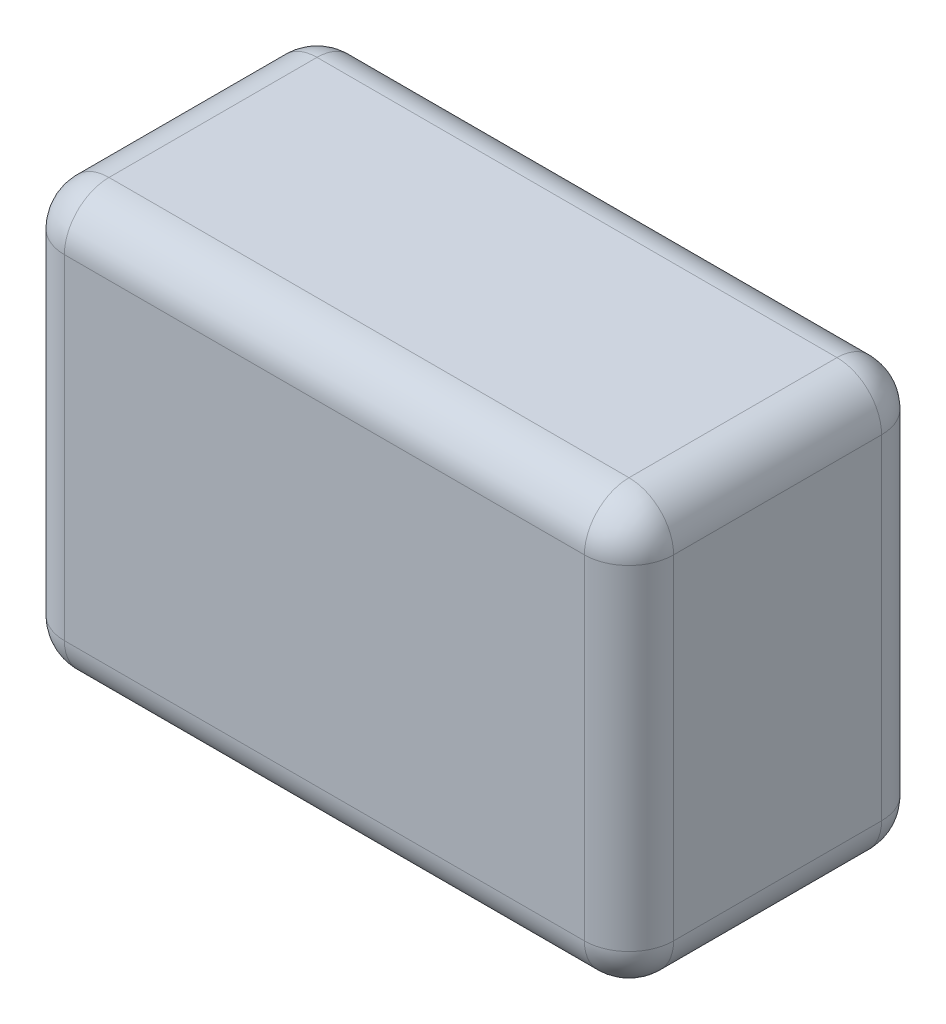
ISO-10303-21;
HEADER;
FILE_DESCRIPTION(('STEP AP214'),'2;1');
FILE_NAME('part.step','',(''),(''),'','','');
FILE_SCHEMA(('AUTOMOTIVE_DESIGN { 1 0 10303 214 1 1 1 1 }'));
ENDSEC;
DATA;
#1=APPLICATION_CONTEXT('core data for automotive mechanical design processes');
#2=APPLICATION_PROTOCOL_DEFINITION('international standard','automotive_design',2000,#1);
#3=PRODUCT_CONTEXT('',#1,'mechanical');
#4=PRODUCT('Part','Part','',(#3));
#5=PRODUCT_RELATED_PRODUCT_CATEGORY('part','',(#4));
#6=PRODUCT_DEFINITION_FORMATION('','',#4);
#7=PRODUCT_DEFINITION_CONTEXT('part definition',#1,'design');
#8=PRODUCT_DEFINITION('design','',#6,#7);
#9=PRODUCT_DEFINITION_SHAPE('','',#8);
#10=(LENGTH_UNIT() NAMED_UNIT(*) SI_UNIT(.MILLI.,.METRE.));
#11=(NAMED_UNIT(*) PLANE_ANGLE_UNIT() SI_UNIT($,.RADIAN.));
#12=(NAMED_UNIT(*) SI_UNIT($,.STERADIAN.) SOLID_ANGLE_UNIT());
#13=UNCERTAINTY_MEASURE_WITH_UNIT(LENGTH_MEASURE(1.E-05),#10,'distance_accuracy_value','');
#14=(GEOMETRIC_REPRESENTATION_CONTEXT(3) GLOBAL_UNCERTAINTY_ASSIGNED_CONTEXT((#13)) GLOBAL_UNIT_ASSIGNED_CONTEXT((#10,
#11,#12)) REPRESENTATION_CONTEXT('',''));
#15=CARTESIAN_POINT('',(0.,0.,0.));
#16=DIRECTION('',(0.,0.,1.));
#17=DIRECTION('',(1.,0.,0.));
#18=AXIS2_PLACEMENT_3D('',#15,#16,#17);
#19=CARTESIAN_POINT('',(-41.,28.5,-20.));
#20=DIRECTION('',(1.,0.,0.));
#21=DIRECTION('',(0.,0.,-1.));
#22=AXIS2_PLACEMENT_3D('',#19,#20,#21);
#23=PLANE('',#22);
#24=DIRECTION('',(0.,-1.,0.));
#25=VECTOR('',#24,1.);
#26=CARTESIAN_POINT('',(-41.,28.5,14.));
#27=LINE('',#26,#25);
#28=CARTESIAN_POINT('',(-41.,-22.5,14.));
#29=VERTEX_POINT('',#28);
#30=CARTESIAN_POINT('',(-41.,22.5,14.));
#31=VERTEX_POINT('',#30);
#32=EDGE_CURVE('E136',#29,#31,#27,.F.);
#33=ORIENTED_EDGE('',*,*,#32,.T.);
#34=DIRECTION('',(0.,0.,1.));
#35=VECTOR('',#34,1.);
#36=CARTESIAN_POINT('',(-41.,22.5,-20.));
#37=LINE('',#36,#35);
#38=CARTESIAN_POINT('',(-41.,22.5,-14.));
#39=VERTEX_POINT('',#38);
#40=EDGE_CURVE('E173',#31,#39,#37,.F.);
#41=ORIENTED_EDGE('',*,*,#40,.T.);
#42=DIRECTION('',(0.,-1.,0.));
#43=VECTOR('',#42,1.);
#44=CARTESIAN_POINT('',(-41.,28.5,-14.));
#45=LINE('',#44,#43);
#46=CARTESIAN_POINT('',(-41.,-22.5,-14.));
#47=VERTEX_POINT('',#46);
#48=EDGE_CURVE('E170',#39,#47,#45,.T.);
#49=ORIENTED_EDGE('',*,*,#48,.T.);
#50=DIRECTION('',(0.,0.,1.));
#51=VECTOR('',#50,1.);
#52=CARTESIAN_POINT('',(-41.,-22.5,-20.));
#53=LINE('',#52,#51);
#54=EDGE_CURVE('E165',#47,#29,#53,.T.);
#55=ORIENTED_EDGE('',*,*,#54,.T.);
#56=EDGE_LOOP('',(#33,#41,#49,#55));
#57=FACE_BOUND('',#56,.T.);
#58=ADVANCED_FACE('F41',(#57),#23,.F.);
#59=CARTESIAN_POINT('',(-41.,28.5,20.));
#60=DIRECTION('',(0.,0.,-1.));
#61=DIRECTION('',(-1.,0.,0.));
#62=AXIS2_PLACEMENT_3D('',#59,#60,#61);
#63=PLANE('',#62);
#64=DIRECTION('',(0.,-1.,0.));
#65=VECTOR('',#64,1.);
#66=CARTESIAN_POINT('',(35.,28.5,20.));
#67=LINE('',#66,#65);
#68=CARTESIAN_POINT('',(35.,-22.5,20.));
#69=VERTEX_POINT('',#68);
#70=CARTESIAN_POINT('',(35.,22.5,20.));
#71=VERTEX_POINT('',#70);
#72=EDGE_CURVE('E158',#69,#71,#67,.F.);
#73=ORIENTED_EDGE('',*,*,#72,.T.);
#74=DIRECTION('',(1.,0.,0.));
#75=VECTOR('',#74,1.);
#76=CARTESIAN_POINT('',(-41.,22.5,20.));
#77=LINE('',#76,#75);
#78=CARTESIAN_POINT('',(-35.,22.5,20.));
#79=VERTEX_POINT('',#78);
#80=EDGE_CURVE('E162',#71,#79,#77,.F.);
#81=ORIENTED_EDGE('',*,*,#80,.T.);
#82=DIRECTION('',(0.,-1.,0.));
#83=VECTOR('',#82,1.);
#84=CARTESIAN_POINT('',(-35.,28.5,20.));
#85=LINE('',#84,#83);
#86=CARTESIAN_POINT('',(-35.,-22.5,20.));
#87=VERTEX_POINT('',#86);
#88=EDGE_CURVE('E134',#79,#87,#85,.T.);
#89=ORIENTED_EDGE('',*,*,#88,.T.);
#90=DIRECTION('',(1.,0.,0.));
#91=VECTOR('',#90,1.);
#92=CARTESIAN_POINT('',(-41.,-22.5,20.));
#93=LINE('',#92,#91);
#94=EDGE_CURVE('E152',#87,#69,#93,.T.);
#95=ORIENTED_EDGE('',*,*,#94,.T.);
#96=EDGE_LOOP('',(#73,#81,#89,#95));
#97=FACE_BOUND('',#96,.T.);
#98=ADVANCED_FACE('F160',(#97),#63,.F.);
#99=CARTESIAN_POINT('',(41.,28.5,-20.));
#100=DIRECTION('',(-1.,0.,0.));
#101=DIRECTION('',(0.,0.,1.));
#102=AXIS2_PLACEMENT_3D('',#99,#100,#101);
#103=PLANE('',#102);
#104=DIRECTION('',(0.,-1.,0.));
#105=VECTOR('',#104,1.);
#106=CARTESIAN_POINT('',(41.,28.5,-14.));
#107=LINE('',#106,#105);
#108=CARTESIAN_POINT('',(41.,-22.5,-14.));
#109=VERTEX_POINT('',#108);
#110=CARTESIAN_POINT('',(41.,22.5,-14.));
#111=VERTEX_POINT('',#110);
#112=EDGE_CURVE('E177',#109,#111,#107,.F.);
#113=ORIENTED_EDGE('',*,*,#112,.T.);
#114=DIRECTION('',(0.,0.,-1.));
#115=VECTOR('',#114,1.);
#116=CARTESIAN_POINT('',(41.,22.5,20.));
#117=LINE('',#116,#115);
#118=CARTESIAN_POINT('',(41.,22.5,14.));
#119=VERTEX_POINT('',#118);
#120=EDGE_CURVE('E182',#111,#119,#117,.F.);
#121=ORIENTED_EDGE('',*,*,#120,.T.);
#122=DIRECTION('',(0.,-1.,0.));
#123=VECTOR('',#122,1.);
#124=CARTESIAN_POINT('',(41.,28.5,14.));
#125=LINE('',#124,#123);
#126=CARTESIAN_POINT('',(41.,-22.5,14.));
#127=VERTEX_POINT('',#126);
#128=EDGE_CURVE('E179',#119,#127,#125,.T.);
#129=ORIENTED_EDGE('',*,*,#128,.T.);
#130=DIRECTION('',(0.,0.,-1.));
#131=VECTOR('',#130,1.);
#132=CARTESIAN_POINT('',(41.,-22.5,-20.));
#133=LINE('',#132,#131);
#134=EDGE_CURVE('E175',#127,#109,#133,.T.);
#135=ORIENTED_EDGE('',*,*,#134,.T.);
#136=EDGE_LOOP('',(#113,#121,#129,#135));
#137=FACE_BOUND('',#136,.T.);
#138=ADVANCED_FACE('F287',(#137),#103,.F.);
#139=CARTESIAN_POINT('',(-41.,28.5,-20.));
#140=DIRECTION('',(0.,0.,1.));
#141=DIRECTION('',(1.,0.,0.));
#142=AXIS2_PLACEMENT_3D('',#139,#140,#141);
#143=PLANE('',#142);
#144=DIRECTION('',(0.,-1.,0.));
#145=VECTOR('',#144,1.);
#146=CARTESIAN_POINT('',(-35.,28.5,-20.));
#147=LINE('',#146,#145);
#148=CARTESIAN_POINT('',(-35.,-22.5,-20.));
#149=VERTEX_POINT('',#148);
#150=CARTESIAN_POINT('',(-35.,22.5,-20.));
#151=VERTEX_POINT('',#150);
#152=EDGE_CURVE('E186',#149,#151,#147,.F.);
#153=ORIENTED_EDGE('',*,*,#152,.T.);
#154=DIRECTION('',(-1.,0.,0.));
#155=VECTOR('',#154,1.);
#156=CARTESIAN_POINT('',(41.,22.5,-20.));
#157=LINE('',#156,#155);
#158=CARTESIAN_POINT('',(35.,22.5,-20.));
#159=VERTEX_POINT('',#158);
#160=EDGE_CURVE('E191',#151,#159,#157,.F.);
#161=ORIENTED_EDGE('',*,*,#160,.T.);
#162=DIRECTION('',(0.,-1.,0.));
#163=VECTOR('',#162,1.);
#164=CARTESIAN_POINT('',(35.,28.5,-20.));
#165=LINE('',#164,#163);
#166=CARTESIAN_POINT('',(35.,-22.5,-20.));
#167=VERTEX_POINT('',#166);
#168=EDGE_CURVE('E188',#159,#167,#165,.T.);
#169=ORIENTED_EDGE('',*,*,#168,.T.);
#170=DIRECTION('',(-1.,0.,0.));
#171=VECTOR('',#170,1.);
#172=CARTESIAN_POINT('',(-41.,-22.5,-20.));
#173=LINE('',#172,#171);
#174=EDGE_CURVE('E184',#167,#149,#173,.T.);
#175=ORIENTED_EDGE('',*,*,#174,.T.);
#176=EDGE_LOOP('',(#153,#161,#169,#175));
#177=FACE_BOUND('',#176,.T.);
#178=ADVANCED_FACE('F297',(#177),#143,.F.);
#179=CARTESIAN_POINT('',(0.,28.5,0.));
#180=DIRECTION('',(0.,1.,0.));
#181=DIRECTION('',(0.,0.,1.));
#182=AXIS2_PLACEMENT_3D('',#179,#180,#181);
#183=PLANE('',#182);
#184=DIRECTION('',(0.,0.,-1.));
#185=VECTOR('',#184,1.);
#186=CARTESIAN_POINT('',(35.,28.5,-20.));
#187=LINE('',#186,#185);
#188=CARTESIAN_POINT('',(35.,28.5,14.));
#189=VERTEX_POINT('',#188);
#190=CARTESIAN_POINT('',(35.,28.5,-14.));
#191=VERTEX_POINT('',#190);
#192=EDGE_CURVE('E197',#189,#191,#187,.T.);
#193=ORIENTED_EDGE('',*,*,#192,.T.);
#194=DIRECTION('',(-1.,0.,0.));
#195=VECTOR('',#194,1.);
#196=CARTESIAN_POINT('',(-41.,28.5,-14.));
#197=LINE('',#196,#195);
#198=CARTESIAN_POINT('',(-35.,28.5,-14.));
#199=VERTEX_POINT('',#198);
#200=EDGE_CURVE('E199',#191,#199,#197,.T.);
#201=ORIENTED_EDGE('',*,*,#200,.T.);
#202=DIRECTION('',(0.,0.,1.));
#203=VECTOR('',#202,1.);
#204=CARTESIAN_POINT('',(-35.,28.5,20.));
#205=LINE('',#204,#203);
#206=CARTESIAN_POINT('',(-35.,28.5,14.));
#207=VERTEX_POINT('',#206);
#208=EDGE_CURVE('E193',#199,#207,#205,.T.);
#209=ORIENTED_EDGE('',*,*,#208,.T.);
#210=DIRECTION('',(1.,0.,0.));
#211=VECTOR('',#210,1.);
#212=CARTESIAN_POINT('',(41.,28.5,14.));
#213=LINE('',#212,#211);
#214=EDGE_CURVE('E195',#207,#189,#213,.T.);
#215=ORIENTED_EDGE('',*,*,#214,.T.);
#216=EDGE_LOOP('',(#193,#201,#209,#215));
#217=FACE_BOUND('',#216,.T.);
#218=ADVANCED_FACE('F279',(#217),#183,.T.);
#219=CARTESIAN_POINT('',(0.,-28.5,0.));
#220=DIRECTION('',(0.,1.,0.));
#221=DIRECTION('',(0.,0.,1.));
#222=AXIS2_PLACEMENT_3D('',#219,#220,#221);
#223=PLANE('',#222);
#224=DIRECTION('',(0.,0.,1.));
#225=VECTOR('',#224,1.);
#226=CARTESIAN_POINT('',(-35.,-28.5,0.));
#227=LINE('',#226,#225);
#228=CARTESIAN_POINT('',(-35.,-28.5,14.));
#229=VERTEX_POINT('',#228);
#230=CARTESIAN_POINT('',(-35.,-28.5,-14.));
#231=VERTEX_POINT('',#230);
#232=EDGE_CURVE('E202',#229,#231,#227,.F.);
#233=ORIENTED_EDGE('',*,*,#232,.T.);
#234=DIRECTION('',(-1.,0.,0.));
#235=VECTOR('',#234,1.);
#236=CARTESIAN_POINT('',(0.,-28.5,-14.));
#237=LINE('',#236,#235);
#238=CARTESIAN_POINT('',(35.,-28.5,-14.));
#239=VERTEX_POINT('',#238);
#240=EDGE_CURVE('E11',#231,#239,#237,.F.);
#241=ORIENTED_EDGE('',*,*,#240,.T.);
#242=DIRECTION('',(0.,0.,-1.));
#243=VECTOR('',#242,1.);
#244=CARTESIAN_POINT('',(35.,-28.5,0.));
#245=LINE('',#244,#243);
#246=CARTESIAN_POINT('',(35.,-28.5,14.));
#247=VERTEX_POINT('',#246);
#248=EDGE_CURVE('E50',#239,#247,#245,.F.);
#249=ORIENTED_EDGE('',*,*,#248,.T.);
#250=DIRECTION('',(1.,0.,0.));
#251=VECTOR('',#250,1.);
#252=CARTESIAN_POINT('',(0.,-28.5,14.));
#253=LINE('',#252,#251);
#254=EDGE_CURVE('E204',#247,#229,#253,.F.);
#255=ORIENTED_EDGE('',*,*,#254,.T.);
#256=EDGE_LOOP('',(#233,#241,#249,#255));
#257=FACE_BOUND('',#256,.T.);
#258=ADVANCED_FACE('F543',(#257),#223,.F.);
#259=CARTESIAN_POINT('',(35.,28.5,-14.));
#260=DIRECTION('',(0.,-1.,0.));
#261=DIRECTION('',(0.,0.,-1.));
#262=AXIS2_PLACEMENT_3D('',#259,#260,#261);
#263=CYLINDRICAL_SURFACE('',#262,6.);
#264=CARTESIAN_POINT('',(35.,22.5,-14.));
#265=DIRECTION('',(0.,1.,0.));
#266=DIRECTION('',(0.,0.,1.));
#267=AXIS2_PLACEMENT_3D('',#264,#265,#266);
#268=CIRCLE('',#267,6.);
#269=EDGE_CURVE('E45',#111,#159,#268,.T.);
#270=ORIENTED_EDGE('',*,*,#269,.F.);
#271=ORIENTED_EDGE('',*,*,#112,.F.);
#272=CARTESIAN_POINT('',(35.,-22.5,-14.));
#273=DIRECTION('',(0.,-1.,0.));
#274=DIRECTION('',(0.,0.,-1.));
#275=AXIS2_PLACEMENT_3D('',#272,#273,#274);
#276=CIRCLE('',#275,6.);
#277=EDGE_CURVE('E257',#167,#109,#276,.T.);
#278=ORIENTED_EDGE('',*,*,#277,.F.);
#279=ORIENTED_EDGE('',*,*,#168,.F.);
#280=EDGE_LOOP('',(#270,#271,#278,#279));
#281=FACE_BOUND('',#280,.T.);
#282=ADVANCED_FACE('F43',(#281),#263,.T.);
#283=CARTESIAN_POINT('',(35.,22.5,-14.));
#284=DIRECTION('',(0.,0.,-1.));
#285=DIRECTION('',(-1.,0.,0.));
#286=AXIS2_PLACEMENT_3D('',#283,#284,#285);
#287=SPHERICAL_SURFACE('',#286,6.);
#288=CARTESIAN_POINT('',(35.,22.5,-14.));
#289=DIRECTION('',(0.,0.,-1.));
#290=DIRECTION('',(-1.,0.,0.));
#291=AXIS2_PLACEMENT_3D('',#288,#289,#290);
#292=CIRCLE('',#291,6.);
#293=EDGE_CURVE('E252',#111,#191,#292,.F.);
#294=ORIENTED_EDGE('',*,*,#293,.F.);
#295=ORIENTED_EDGE('',*,*,#269,.T.);
#296=CARTESIAN_POINT('',(35.,22.5,-14.));
#297=DIRECTION('',(1.,0.,0.));
#298=DIRECTION('',(0.,1.,0.));
#299=AXIS2_PLACEMENT_3D('',#296,#297,#298);
#300=CIRCLE('',#299,6.);
#301=EDGE_CURVE('E255',#191,#159,#300,.F.);
#302=ORIENTED_EDGE('',*,*,#301,.F.);
#303=EDGE_LOOP('',(#294,#295,#302));
#304=FACE_BOUND('',#303,.T.);
#305=ADVANCED_FACE('F267',(#304),#287,.T.);
#306=CARTESIAN_POINT('',(35.,-22.5,-14.));
#307=DIRECTION('',(1.,0.,0.));
#308=DIRECTION('',(0.,0.,-1.));
#309=AXIS2_PLACEMENT_3D('',#306,#307,#308);
#310=SPHERICAL_SURFACE('',#309,6.);
#311=CARTESIAN_POINT('',(35.,-22.5,-14.));
#312=DIRECTION('',(1.,0.,0.));
#313=DIRECTION('',(0.,0.,-1.));
#314=AXIS2_PLACEMENT_3D('',#311,#312,#313);
#315=CIRCLE('',#314,6.);
#316=EDGE_CURVE('E247',#167,#239,#315,.F.);
#317=ORIENTED_EDGE('',*,*,#316,.F.);
#318=ORIENTED_EDGE('',*,*,#277,.T.);
#319=CARTESIAN_POINT('',(35.,-22.5,-14.));
#320=DIRECTION('',(0.,0.,-1.));
#321=DIRECTION('',(-1.,0.,0.));
#322=AXIS2_PLACEMENT_3D('',#319,#320,#321);
#323=CIRCLE('',#322,6.);
#324=EDGE_CURVE('E250',#239,#109,#323,.F.);
#325=ORIENTED_EDGE('',*,*,#324,.F.);
#326=EDGE_LOOP('',(#317,#318,#325));
#327=FACE_BOUND('',#326,.T.);
#328=ADVANCED_FACE('F513',(#327),#310,.T.);
#329=CARTESIAN_POINT('',(0.,22.5,-14.));
#330=DIRECTION('',(1.,0.,0.));
#331=DIRECTION('',(0.,0.,-1.));
#332=AXIS2_PLACEMENT_3D('',#329,#330,#331);
#333=CYLINDRICAL_SURFACE('',#332,6.);
#334=ORIENTED_EDGE('',*,*,#301,.T.);
#335=ORIENTED_EDGE('',*,*,#160,.F.);
#336=CARTESIAN_POINT('',(-35.,22.5,-14.));
#337=DIRECTION('',(-1.,0.,0.));
#338=DIRECTION('',(0.,0.,1.));
#339=AXIS2_PLACEMENT_3D('',#336,#337,#338);
#340=CIRCLE('',#339,6.);
#341=EDGE_CURVE('E241',#199,#151,#340,.T.);
#342=ORIENTED_EDGE('',*,*,#341,.F.);
#343=ORIENTED_EDGE('',*,*,#200,.F.);
#344=EDGE_LOOP('',(#334,#335,#342,#343));
#345=FACE_BOUND('',#344,.T.);
#346=ADVANCED_FACE('F275',(#345),#333,.T.);
#347=CARTESIAN_POINT('',(35.,22.5,0.));
#348=DIRECTION('',(0.,0.,1.));
#349=DIRECTION('',(1.,0.,0.));
#350=AXIS2_PLACEMENT_3D('',#347,#348,#349);
#351=CYLINDRICAL_SURFACE('',#350,6.);
#352=ORIENTED_EDGE('',*,*,#293,.T.);
#353=ORIENTED_EDGE('',*,*,#192,.F.);
#354=CARTESIAN_POINT('',(35.,22.5,14.));
#355=DIRECTION('',(0.,0.,1.));
#356=DIRECTION('',(1.,0.,0.));
#357=AXIS2_PLACEMENT_3D('',#354,#355,#356);
#358=CIRCLE('',#357,6.);
#359=EDGE_CURVE('E238',#119,#189,#358,.T.);
#360=ORIENTED_EDGE('',*,*,#359,.F.);
#361=ORIENTED_EDGE('',*,*,#120,.F.);
#362=EDGE_LOOP('',(#352,#353,#360,#361));
#363=FACE_BOUND('',#362,.T.);
#364=ADVANCED_FACE('F284',(#363),#351,.T.);
#365=CARTESIAN_POINT('',(35.,28.5,14.));
#366=DIRECTION('',(0.,-1.,0.));
#367=DIRECTION('',(0.,0.,-1.));
#368=AXIS2_PLACEMENT_3D('',#365,#366,#367);
#369=CYLINDRICAL_SURFACE('',#368,6.);
#370=CARTESIAN_POINT('',(35.,-22.5,14.));
#371=DIRECTION('',(0.,-1.,0.));
#372=DIRECTION('',(0.,0.,-1.));
#373=AXIS2_PLACEMENT_3D('',#370,#371,#372);
#374=CIRCLE('',#373,6.);
#375=EDGE_CURVE('E232',#127,#69,#374,.T.);
#376=ORIENTED_EDGE('',*,*,#375,.F.);
#377=ORIENTED_EDGE('',*,*,#128,.F.);
#378=CARTESIAN_POINT('',(35.,22.5,14.));
#379=DIRECTION('',(0.,1.,0.));
#380=DIRECTION('',(0.,0.,1.));
#381=AXIS2_PLACEMENT_3D('',#378,#379,#380);
#382=CIRCLE('',#381,6.);
#383=EDGE_CURVE('E235',#71,#119,#382,.T.);
#384=ORIENTED_EDGE('',*,*,#383,.F.);
#385=ORIENTED_EDGE('',*,*,#72,.F.);
#386=EDGE_LOOP('',(#376,#377,#384,#385));
#387=FACE_BOUND('',#386,.T.);
#388=ADVANCED_FACE('F291',(#387),#369,.T.);
#389=CARTESIAN_POINT('',(35.,-22.5,-20.));
#390=DIRECTION('',(0.,0.,-1.));
#391=DIRECTION('',(-1.,0.,0.));
#392=AXIS2_PLACEMENT_3D('',#389,#390,#391);
#393=CYLINDRICAL_SURFACE('',#392,6.);
#394=ORIENTED_EDGE('',*,*,#324,.T.);
#395=ORIENTED_EDGE('',*,*,#134,.F.);
#396=CARTESIAN_POINT('',(35.,-22.5,14.));
#397=DIRECTION('',(0.,0.,1.));
#398=DIRECTION('',(1.,0.,0.));
#399=AXIS2_PLACEMENT_3D('',#396,#397,#398);
#400=CIRCLE('',#399,6.);
#401=EDGE_CURVE('E230',#247,#127,#400,.T.);
#402=ORIENTED_EDGE('',*,*,#401,.F.);
#403=ORIENTED_EDGE('',*,*,#248,.F.);
#404=EDGE_LOOP('',(#394,#395,#402,#403));
#405=FACE_BOUND('',#404,.T.);
#406=ADVANCED_FACE('F295',(#405),#393,.T.);
#407=CARTESIAN_POINT('',(-41.,-22.5,-14.));
#408=DIRECTION('',(-1.,0.,0.));
#409=DIRECTION('',(0.,0.,1.));
#410=AXIS2_PLACEMENT_3D('',#407,#408,#409);
#411=CYLINDRICAL_SURFACE('',#410,6.);
#412=ORIENTED_EDGE('',*,*,#316,.T.);
#413=ORIENTED_EDGE('',*,*,#240,.F.);
#414=CARTESIAN_POINT('',(-35.,-22.5,-14.));
#415=DIRECTION('',(-1.,0.,0.));
#416=DIRECTION('',(0.,0.,1.));
#417=AXIS2_PLACEMENT_3D('',#414,#415,#416);
#418=CIRCLE('',#417,6.);
#419=EDGE_CURVE('E227',#149,#231,#418,.T.);
#420=ORIENTED_EDGE('',*,*,#419,.F.);
#421=ORIENTED_EDGE('',*,*,#174,.F.);
#422=EDGE_LOOP('',(#412,#413,#420,#421));
#423=FACE_BOUND('',#422,.T.);
#424=ADVANCED_FACE('F307',(#423),#411,.T.);
#425=CARTESIAN_POINT('',(-35.,28.5,-14.));
#426=DIRECTION('',(0.,-1.,0.));
#427=DIRECTION('',(0.,0.,-1.));
#428=AXIS2_PLACEMENT_3D('',#425,#426,#427);
#429=CYLINDRICAL_SURFACE('',#428,6.);
#430=CARTESIAN_POINT('',(-35.,22.5,-14.));
#431=DIRECTION('',(0.,1.,0.));
#432=DIRECTION('',(0.,0.,1.));
#433=AXIS2_PLACEMENT_3D('',#430,#431,#432);
#434=CIRCLE('',#433,6.);
#435=EDGE_CURVE('E244',#151,#39,#434,.T.);
#436=ORIENTED_EDGE('',*,*,#435,.F.);
#437=ORIENTED_EDGE('',*,*,#152,.F.);
#438=CARTESIAN_POINT('',(-35.,-22.5,-14.));
#439=DIRECTION('',(0.,-1.,0.));
#440=DIRECTION('',(0.,0.,-1.));
#441=AXIS2_PLACEMENT_3D('',#438,#439,#440);
#442=CIRCLE('',#441,6.);
#443=EDGE_CURVE('E224',#47,#149,#442,.T.);
#444=ORIENTED_EDGE('',*,*,#443,.F.);
#445=ORIENTED_EDGE('',*,*,#48,.F.);
#446=EDGE_LOOP('',(#436,#437,#444,#445));
#447=FACE_BOUND('',#446,.T.);
#448=ADVANCED_FACE('F302',(#447),#429,.T.);
#449=CARTESIAN_POINT('',(-35.,22.5,-14.));
#450=DIRECTION('',(0.,0.,-1.));
#451=DIRECTION('',(-1.,0.,0.));
#452=AXIS2_PLACEMENT_3D('',#449,#450,#451);
#453=SPHERICAL_SURFACE('',#452,6.);
#454=ORIENTED_EDGE('',*,*,#341,.T.);
#455=ORIENTED_EDGE('',*,*,#435,.T.);
#456=CARTESIAN_POINT('',(-35.,22.5,-14.));
#457=DIRECTION('',(0.,0.,-1.));
#458=DIRECTION('',(-1.,0.,0.));
#459=AXIS2_PLACEMENT_3D('',#456,#457,#458);
#460=CIRCLE('',#459,6.);
#461=EDGE_CURVE('E221',#199,#39,#460,.F.);
#462=ORIENTED_EDGE('',*,*,#461,.F.);
#463=EDGE_LOOP('',(#454,#455,#462));
#464=FACE_BOUND('',#463,.T.);
#465=ADVANCED_FACE('F318',(#464),#453,.T.);
#466=CARTESIAN_POINT('',(35.,22.5,14.));
#467=DIRECTION('',(1.,0.,0.));
#468=DIRECTION('',(0.,0.,-1.));
#469=AXIS2_PLACEMENT_3D('',#466,#467,#468);
#470=SPHERICAL_SURFACE('',#469,6.);
#471=ORIENTED_EDGE('',*,*,#383,.T.);
#472=ORIENTED_EDGE('',*,*,#359,.T.);
#473=CARTESIAN_POINT('',(35.,22.5,14.));
#474=DIRECTION('',(1.,0.,0.));
#475=DIRECTION('',(0.,0.,-1.));
#476=AXIS2_PLACEMENT_3D('',#473,#474,#475);
#477=CIRCLE('',#476,6.);
#478=EDGE_CURVE('E218',#71,#189,#477,.F.);
#479=ORIENTED_EDGE('',*,*,#478,.F.);
#480=EDGE_LOOP('',(#471,#472,#479));
#481=FACE_BOUND('',#480,.T.);
#482=ADVANCED_FACE('F328',(#481),#470,.T.);
#483=CARTESIAN_POINT('',(35.,-22.5,14.));
#484=DIRECTION('',(1.,0.,0.));
#485=DIRECTION('',(0.,0.,-1.));
#486=AXIS2_PLACEMENT_3D('',#483,#484,#485);
#487=SPHERICAL_SURFACE('',#486,6.);
#488=ORIENTED_EDGE('',*,*,#401,.T.);
#489=ORIENTED_EDGE('',*,*,#375,.T.);
#490=CARTESIAN_POINT('',(35.,-22.5,14.));
#491=DIRECTION('',(1.,0.,0.));
#492=DIRECTION('',(0.,0.,-1.));
#493=AXIS2_PLACEMENT_3D('',#490,#491,#492);
#494=CIRCLE('',#493,6.);
#495=EDGE_CURVE('E155',#247,#69,#494,.F.);
#496=ORIENTED_EDGE('',*,*,#495,.F.);
#497=EDGE_LOOP('',(#488,#489,#496));
#498=FACE_BOUND('',#497,.T.);
#499=ADVANCED_FACE('F330',(#498),#487,.T.);
#500=CARTESIAN_POINT('',(-35.,-22.5,-14.));
#501=DIRECTION('',(0.,0.,-1.));
#502=DIRECTION('',(0.,1.,0.));
#503=AXIS2_PLACEMENT_3D('',#500,#501,#502);
#504=SPHERICAL_SURFACE('',#503,6.);
#505=ORIENTED_EDGE('',*,*,#443,.T.);
#506=ORIENTED_EDGE('',*,*,#419,.T.);
#507=CARTESIAN_POINT('',(-35.,-22.5,-14.));
#508=DIRECTION('',(0.,0.,-1.));
#509=DIRECTION('',(-1.,0.,0.));
#510=AXIS2_PLACEMENT_3D('',#507,#508,#509);
#511=CIRCLE('',#510,6.);
#512=EDGE_CURVE('E214',#47,#231,#511,.F.);
#513=ORIENTED_EDGE('',*,*,#512,.F.);
#514=EDGE_LOOP('',(#505,#506,#513));
#515=FACE_BOUND('',#514,.T.);
#516=ADVANCED_FACE('F309',(#515),#504,.T.);
#517=CARTESIAN_POINT('',(-35.,22.5,0.));
#518=DIRECTION('',(0.,0.,-1.));
#519=DIRECTION('',(-1.,0.,0.));
#520=AXIS2_PLACEMENT_3D('',#517,#518,#519);
#521=CYLINDRICAL_SURFACE('',#520,6.);
#522=ORIENTED_EDGE('',*,*,#461,.T.);
#523=ORIENTED_EDGE('',*,*,#40,.F.);
#524=CARTESIAN_POINT('',(-35.,22.5,14.));
#525=DIRECTION('',(0.,0.,1.));
#526=DIRECTION('',(1.,0.,0.));
#527=AXIS2_PLACEMENT_3D('',#524,#525,#526);
#528=CIRCLE('',#527,6.);
#529=EDGE_CURVE('E211',#207,#31,#528,.T.);
#530=ORIENTED_EDGE('',*,*,#529,.F.);
#531=ORIENTED_EDGE('',*,*,#208,.F.);
#532=EDGE_LOOP('',(#522,#523,#530,#531));
#533=FACE_BOUND('',#532,.T.);
#534=ADVANCED_FACE('F320',(#533),#521,.T.);
#535=CARTESIAN_POINT('',(0.,22.5,14.));
#536=DIRECTION('',(-1.,0.,0.));
#537=DIRECTION('',(0.,0.,1.));
#538=AXIS2_PLACEMENT_3D('',#535,#536,#537);
#539=CYLINDRICAL_SURFACE('',#538,6.);
#540=ORIENTED_EDGE('',*,*,#478,.T.);
#541=ORIENTED_EDGE('',*,*,#214,.F.);
#542=CARTESIAN_POINT('',(-35.,22.5,14.));
#543=DIRECTION('',(-1.,0.,0.));
#544=DIRECTION('',(0.,0.,1.));
#545=AXIS2_PLACEMENT_3D('',#542,#543,#544);
#546=CIRCLE('',#545,6.);
#547=EDGE_CURVE('E149',#79,#207,#546,.T.);
#548=ORIENTED_EDGE('',*,*,#547,.F.);
#549=ORIENTED_EDGE('',*,*,#80,.F.);
#550=EDGE_LOOP('',(#540,#541,#548,#549));
#551=FACE_BOUND('',#550,.T.);
#552=ADVANCED_FACE('F326',(#551),#539,.T.);
#553=CARTESIAN_POINT('',(-41.,-22.5,14.));
#554=DIRECTION('',(1.,0.,0.));
#555=DIRECTION('',(0.,0.,-1.));
#556=AXIS2_PLACEMENT_3D('',#553,#554,#555);
#557=CYLINDRICAL_SURFACE('',#556,6.);
#558=ORIENTED_EDGE('',*,*,#495,.T.);
#559=ORIENTED_EDGE('',*,*,#94,.F.);
#560=CARTESIAN_POINT('',(-35.,-22.5,14.));
#561=DIRECTION('',(-1.,0.,0.));
#562=DIRECTION('',(0.,0.,1.));
#563=AXIS2_PLACEMENT_3D('',#560,#561,#562);
#564=CIRCLE('',#563,6.);
#565=EDGE_CURVE('E142',#229,#87,#564,.T.);
#566=ORIENTED_EDGE('',*,*,#565,.F.);
#567=ORIENTED_EDGE('',*,*,#254,.F.);
#568=EDGE_LOOP('',(#558,#559,#566,#567));
#569=FACE_BOUND('',#568,.T.);
#570=ADVANCED_FACE('F153',(#569),#557,.T.);
#571=CARTESIAN_POINT('',(-35.,-22.5,-20.));
#572=DIRECTION('',(0.,0.,1.));
#573=DIRECTION('',(1.,0.,0.));
#574=AXIS2_PLACEMENT_3D('',#571,#572,#573);
#575=CYLINDRICAL_SURFACE('',#574,6.);
#576=ORIENTED_EDGE('',*,*,#512,.T.);
#577=ORIENTED_EDGE('',*,*,#232,.F.);
#578=CARTESIAN_POINT('',(-35.,-22.5,14.));
#579=DIRECTION('',(0.,0.,1.));
#580=DIRECTION('',(1.,0.,0.));
#581=AXIS2_PLACEMENT_3D('',#578,#579,#580);
#582=CIRCLE('',#581,6.);
#583=EDGE_CURVE('E146',#29,#229,#582,.T.);
#584=ORIENTED_EDGE('',*,*,#583,.F.);
#585=ORIENTED_EDGE('',*,*,#54,.F.);
#586=EDGE_LOOP('',(#576,#577,#584,#585));
#587=FACE_BOUND('',#586,.T.);
#588=ADVANCED_FACE('F313',(#587),#575,.T.);
#589=CARTESIAN_POINT('',(-35.,22.5,14.));
#590=DIRECTION('',(0.,1.,0.));
#591=DIRECTION('',(0.,0.,1.));
#592=AXIS2_PLACEMENT_3D('',#589,#590,#591);
#593=SPHERICAL_SURFACE('',#592,6.);
#594=ORIENTED_EDGE('',*,*,#547,.T.);
#595=ORIENTED_EDGE('',*,*,#529,.T.);
#596=CARTESIAN_POINT('',(-35.,22.5,14.));
#597=DIRECTION('',(0.,1.,0.));
#598=DIRECTION('',(0.,0.,1.));
#599=AXIS2_PLACEMENT_3D('',#596,#597,#598);
#600=CIRCLE('',#599,6.);
#601=EDGE_CURVE('E139',#79,#31,#600,.F.);
#602=ORIENTED_EDGE('',*,*,#601,.F.);
#603=EDGE_LOOP('',(#594,#595,#602));
#604=FACE_BOUND('',#603,.T.);
#605=ADVANCED_FACE('F324',(#604),#593,.T.);
#606=CARTESIAN_POINT('',(-35.,-22.5,14.));
#607=DIRECTION('',(0.,-1.,0.));
#608=DIRECTION('',(0.,0.,-1.));
#609=AXIS2_PLACEMENT_3D('',#606,#607,#608);
#610=SPHERICAL_SURFACE('',#609,6.);
#611=ORIENTED_EDGE('',*,*,#583,.T.);
#612=ORIENTED_EDGE('',*,*,#565,.T.);
#613=CARTESIAN_POINT('',(-35.,-22.5,14.));
#614=DIRECTION('',(0.,-1.,0.));
#615=DIRECTION('',(0.,0.,-1.));
#616=AXIS2_PLACEMENT_3D('',#613,#614,#615);
#617=CIRCLE('',#616,6.);
#618=EDGE_CURVE('E130',#29,#87,#617,.F.);
#619=ORIENTED_EDGE('',*,*,#618,.F.);
#620=EDGE_LOOP('',(#611,#612,#619));
#621=FACE_BOUND('',#620,.T.);
#622=ADVANCED_FACE('F144',(#621),#610,.T.);
#623=CARTESIAN_POINT('',(-35.,28.5,14.));
#624=DIRECTION('',(0.,-1.,0.));
#625=DIRECTION('',(0.,0.,-1.));
#626=AXIS2_PLACEMENT_3D('',#623,#624,#625);
#627=CYLINDRICAL_SURFACE('',#626,6.);
#628=ORIENTED_EDGE('',*,*,#601,.T.);
#629=ORIENTED_EDGE('',*,*,#32,.F.);
#630=ORIENTED_EDGE('',*,*,#618,.T.);
#631=ORIENTED_EDGE('',*,*,#88,.F.);
#632=EDGE_LOOP('',(#628,#629,#630,#631));
#633=FACE_BOUND('',#632,.T.);
#634=ADVANCED_FACE('F132',(#633),#627,.T.);
#635=CLOSED_SHELL('',(#58,#98,#138,#178,#218,#258,#282,#305,#328,#346,#364,#388,#406,#424,#448,
#465,#482,#499,#516,#534,#552,#570,#588,#605,#622,#634));
#636=MANIFOLD_SOLID_BREP('B2',#635);
#637=ADVANCED_BREP_SHAPE_REPRESENTATION('',(#18,#636),#14);
#638=SHAPE_DEFINITION_REPRESENTATION(#9,#637);
ENDSEC;
END-ISO-10303-21;
